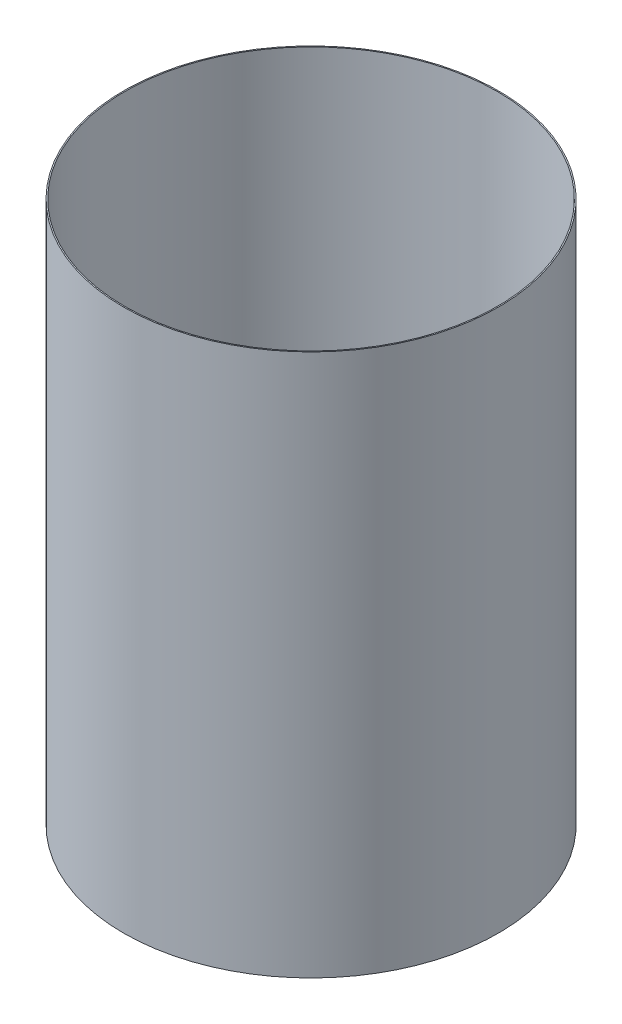
ISO-10303-21;
HEADER;
FILE_DESCRIPTION(('STEP AP214'),'2;1');
FILE_NAME('part.step','',(''),(''),'','','');
FILE_SCHEMA(('AUTOMOTIVE_DESIGN { 1 0 10303 214 1 1 1 1 }'));
ENDSEC;
DATA;
#1=APPLICATION_CONTEXT('core data for automotive mechanical design processes');
#2=APPLICATION_PROTOCOL_DEFINITION('international standard','automotive_design',2000,#1);
#3=PRODUCT_CONTEXT('',#1,'mechanical');
#4=PRODUCT('Part','Part','',(#3));
#5=PRODUCT_RELATED_PRODUCT_CATEGORY('part','',(#4));
#6=PRODUCT_DEFINITION_FORMATION('','',#4);
#7=PRODUCT_DEFINITION_CONTEXT('part definition',#1,'design');
#8=PRODUCT_DEFINITION('design','',#6,#7);
#9=PRODUCT_DEFINITION_SHAPE('','',#8);
#10=(LENGTH_UNIT() NAMED_UNIT(*) SI_UNIT(.MILLI.,.METRE.));
#11=(NAMED_UNIT(*) PLANE_ANGLE_UNIT() SI_UNIT($,.RADIAN.));
#12=(NAMED_UNIT(*) SI_UNIT($,.STERADIAN.) SOLID_ANGLE_UNIT());
#13=UNCERTAINTY_MEASURE_WITH_UNIT(LENGTH_MEASURE(1.E-05),#10,'distance_accuracy_value','');
#14=(GEOMETRIC_REPRESENTATION_CONTEXT(3) GLOBAL_UNCERTAINTY_ASSIGNED_CONTEXT((#13)) GLOBAL_UNIT_ASSIGNED_CONTEXT((#10,
#11,#12)) REPRESENTATION_CONTEXT('',''));
#15=CARTESIAN_POINT('',(0.,0.,0.));
#16=DIRECTION('',(0.,0.,1.));
#17=DIRECTION('',(1.,0.,0.));
#18=AXIS2_PLACEMENT_3D('',#15,#16,#17);
#19=CARTESIAN_POINT('',(7.9,81.5,0.));
#20=DIRECTION('',(0.,1.,0.));
#21=DIRECTION('',(0.,0.,1.));
#22=AXIS2_PLACEMENT_3D('',#19,#20,#21);
#23=PLANE('',#22);
#24=CARTESIAN_POINT('',(0.,81.5,0.));
#25=DIRECTION('',(0.,1.,0.));
#26=DIRECTION('',(0.,0.,1.));
#27=AXIS2_PLACEMENT_3D('',#24,#25,#26);
#28=CIRCLE('',#27,7.95);
#29=CARTESIAN_POINT('',(0.,81.5,7.95));
#30=VERTEX_POINT('',#29);
#31=EDGE_CURVE('E10',#30,#30,#28,.T.);
#32=ORIENTED_EDGE('',*,*,#31,.T.);
#33=EDGE_LOOP('',(#32));
#34=FACE_BOUND('',#33,.T.);
#35=CARTESIAN_POINT('',(0.,81.5,0.));
#36=DIRECTION('',(0.,1.,0.));
#37=DIRECTION('',(0.,0.,1.));
#38=AXIS2_PLACEMENT_3D('',#35,#36,#37);
#39=CIRCLE('',#38,7.9);
#40=CARTESIAN_POINT('',(0.,81.5,7.9));
#41=VERTEX_POINT('',#40);
#42=EDGE_CURVE('E51',#41,#41,#39,.T.);
#43=ORIENTED_EDGE('',*,*,#42,.F.);
#44=EDGE_LOOP('',(#43));
#45=FACE_BOUND('',#44,.T.);
#46=ADVANCED_FACE('F37',(#34,#45),#23,.T.);
#47=CARTESIAN_POINT('',(0.,58.5,0.));
#48=DIRECTION('',(0.,1.,0.));
#49=DIRECTION('',(0.,0.,1.));
#50=AXIS2_PLACEMENT_3D('',#47,#48,#49);
#51=CYLINDRICAL_SURFACE('',#50,7.95);
#52=CARTESIAN_POINT('',(0.,58.5,0.));
#53=DIRECTION('',(0.,1.,0.));
#54=DIRECTION('',(0.,0.,1.));
#55=AXIS2_PLACEMENT_3D('',#52,#53,#54);
#56=CIRCLE('',#55,7.95);
#57=CARTESIAN_POINT('',(0.,58.5,7.95));
#58=VERTEX_POINT('',#57);
#59=EDGE_CURVE('E43',#58,#58,#56,.T.);
#60=ORIENTED_EDGE('',*,*,#59,.T.);
#61=EDGE_LOOP('',(#60));
#62=FACE_BOUND('',#61,.T.);
#63=ORIENTED_EDGE('',*,*,#31,.F.);
#64=EDGE_LOOP('',(#63));
#65=FACE_BOUND('',#64,.T.);
#66=ADVANCED_FACE('F61',(#62,#65),#51,.T.);
#67=CARTESIAN_POINT('',(7.95,58.5,0.));
#68=DIRECTION('',(0.,-1.,0.));
#69=DIRECTION('',(0.,0.,-1.));
#70=AXIS2_PLACEMENT_3D('',#67,#68,#69);
#71=PLANE('',#70);
#72=CARTESIAN_POINT('',(0.,58.5,0.));
#73=DIRECTION('',(0.,1.,0.));
#74=DIRECTION('',(0.,0.,1.));
#75=AXIS2_PLACEMENT_3D('',#72,#73,#74);
#76=CIRCLE('',#75,7.9);
#77=CARTESIAN_POINT('',(0.,58.5,7.9));
#78=VERTEX_POINT('',#77);
#79=EDGE_CURVE('E47',#78,#78,#76,.T.);
#80=ORIENTED_EDGE('',*,*,#79,.T.);
#81=EDGE_LOOP('',(#80));
#82=FACE_BOUND('',#81,.T.);
#83=ORIENTED_EDGE('',*,*,#59,.F.);
#84=EDGE_LOOP('',(#83));
#85=FACE_BOUND('',#84,.T.);
#86=ADVANCED_FACE('F65',(#82,#85),#71,.T.);
#87=CARTESIAN_POINT('',(0.,58.5,0.));
#88=DIRECTION('',(0.,1.,0.));
#89=DIRECTION('',(0.,0.,1.));
#90=AXIS2_PLACEMENT_3D('',#87,#88,#89);
#91=CYLINDRICAL_SURFACE('',#90,7.9);
#92=ORIENTED_EDGE('',*,*,#42,.T.);
#93=EDGE_LOOP('',(#92));
#94=FACE_BOUND('',#93,.T.);
#95=ORIENTED_EDGE('',*,*,#79,.F.);
#96=EDGE_LOOP('',(#95));
#97=FACE_BOUND('',#96,.T.);
#98=ADVANCED_FACE('F57',(#94,#97),#91,.F.);
#99=CLOSED_SHELL('',(#46,#66,#86,#98));
#100=MANIFOLD_SOLID_BREP('B2',#99);
#101=ADVANCED_BREP_SHAPE_REPRESENTATION('',(#18,#100),#14);
#102=SHAPE_DEFINITION_REPRESENTATION(#9,#101);
ENDSEC;
END-ISO-10303-21;
